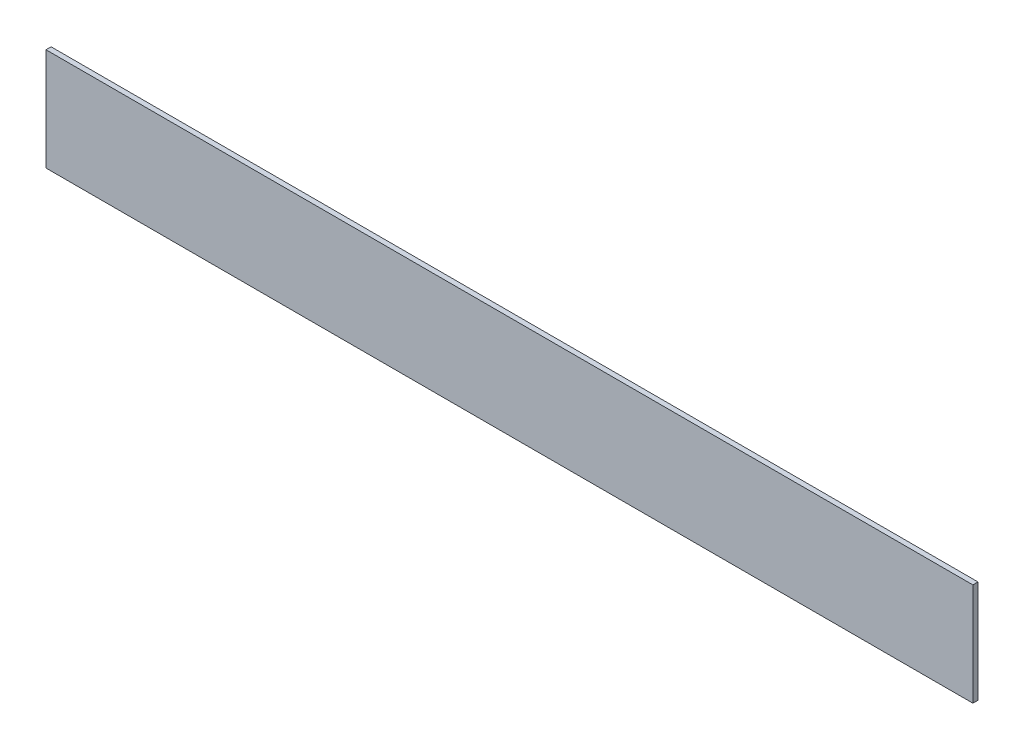
ISO-10303-21;
HEADER;
FILE_DESCRIPTION(('STEP AP214'),'2;1');
FILE_NAME('part.step','',(''),(''),'','','');
FILE_SCHEMA(('AUTOMOTIVE_DESIGN { 1 0 10303 214 1 1 1 1 }'));
ENDSEC;
DATA;
#1=APPLICATION_CONTEXT('core data for automotive mechanical design processes');
#2=APPLICATION_PROTOCOL_DEFINITION('international standard','automotive_design',2000,#1);
#3=PRODUCT_CONTEXT('',#1,'mechanical');
#4=PRODUCT('Part','Part','',(#3));
#5=PRODUCT_RELATED_PRODUCT_CATEGORY('part','',(#4));
#6=PRODUCT_DEFINITION_FORMATION('','',#4);
#7=PRODUCT_DEFINITION_CONTEXT('part definition',#1,'design');
#8=PRODUCT_DEFINITION('design','',#6,#7);
#9=PRODUCT_DEFINITION_SHAPE('','',#8);
#10=(LENGTH_UNIT() NAMED_UNIT(*) SI_UNIT(.MILLI.,.METRE.));
#11=(NAMED_UNIT(*) PLANE_ANGLE_UNIT() SI_UNIT($,.RADIAN.));
#12=(NAMED_UNIT(*) SI_UNIT($,.STERADIAN.) SOLID_ANGLE_UNIT());
#13=UNCERTAINTY_MEASURE_WITH_UNIT(LENGTH_MEASURE(1.E-05),#10,'distance_accuracy_value','');
#14=(GEOMETRIC_REPRESENTATION_CONTEXT(3) GLOBAL_UNCERTAINTY_ASSIGNED_CONTEXT((#13)) GLOBAL_UNIT_ASSIGNED_CONTEXT((#10,
#11,#12)) REPRESENTATION_CONTEXT('',''));
#15=CARTESIAN_POINT('',(0.,0.,0.));
#16=DIRECTION('',(0.,0.,1.));
#17=DIRECTION('',(1.,0.,0.));
#18=AXIS2_PLACEMENT_3D('',#15,#16,#17);
#19=CARTESIAN_POINT('',(-904.5,99.9999999999999,10.));
#20=DIRECTION('',(1.,0.,0.));
#21=DIRECTION('',(0.,0.,-1.));
#22=AXIS2_PLACEMENT_3D('',#19,#20,#21);
#23=PLANE('',#22);
#24=DIRECTION('',(0.,-1.,0.));
#25=VECTOR('',#24,1.);
#26=CARTESIAN_POINT('',(-904.5,99.9999999999999,0.));
#27=LINE('',#26,#25);
#28=CARTESIAN_POINT('',(-904.5,99.9999999999999,0.));
#29=VERTEX_POINT('',#28);
#30=CARTESIAN_POINT('',(-904.5,-100.,0.));
#31=VERTEX_POINT('',#30);
#32=EDGE_CURVE('E95',#29,#31,#27,.T.);
#33=ORIENTED_EDGE('',*,*,#32,.T.);
#34=DIRECTION('',(0.,0.,-1.));
#35=VECTOR('',#34,1.);
#36=CARTESIAN_POINT('',(-904.5,-100.,10.));
#37=LINE('',#36,#35);
#38=CARTESIAN_POINT('',(-904.5,-100.,10.));
#39=VERTEX_POINT('',#38);
#40=EDGE_CURVE('E11',#39,#31,#37,.T.);
#41=ORIENTED_EDGE('',*,*,#40,.F.);
#42=DIRECTION('',(0.,-1.,0.));
#43=VECTOR('',#42,1.);
#44=CARTESIAN_POINT('',(-904.5,99.9999999999999,10.));
#45=LINE('',#44,#43);
#46=CARTESIAN_POINT('',(-904.5,99.9999999999999,10.));
#47=VERTEX_POINT('',#46);
#48=EDGE_CURVE('E83',#47,#39,#45,.T.);
#49=ORIENTED_EDGE('',*,*,#48,.F.);
#50=DIRECTION('',(0.,0.,-1.));
#51=VECTOR('',#50,1.);
#52=CARTESIAN_POINT('',(-904.5,99.9999999999999,10.));
#53=LINE('',#52,#51);
#54=EDGE_CURVE('E91',#47,#29,#53,.T.);
#55=ORIENTED_EDGE('',*,*,#54,.T.);
#56=EDGE_LOOP('',(#33,#41,#49,#55));
#57=FACE_BOUND('',#56,.T.);
#58=ADVANCED_FACE('F32',(#57),#23,.F.);
#59=CARTESIAN_POINT('',(904.5,-99.9999999999999,10.));
#60=DIRECTION('',(0.,1.,0.));
#61=DIRECTION('',(-1.,0.,0.));
#62=AXIS2_PLACEMENT_3D('',#59,#60,#61);
#63=PLANE('',#62);
#64=DIRECTION('',(1.,0.,0.));
#65=VECTOR('',#64,1.);
#66=CARTESIAN_POINT('',(904.5,-99.9999999999999,0.));
#67=LINE('',#66,#65);
#68=CARTESIAN_POINT('',(904.5,-99.9999999999999,0.));
#69=VERTEX_POINT('',#68);
#70=EDGE_CURVE('E87',#31,#69,#67,.T.);
#71=ORIENTED_EDGE('',*,*,#70,.T.);
#72=DIRECTION('',(0.,0.,-1.));
#73=VECTOR('',#72,1.);
#74=CARTESIAN_POINT('',(904.5,-99.9999999999999,10.));
#75=LINE('',#74,#73);
#76=CARTESIAN_POINT('',(904.5,-99.9999999999999,10.));
#77=VERTEX_POINT('',#76);
#78=EDGE_CURVE('E40',#77,#69,#75,.T.);
#79=ORIENTED_EDGE('',*,*,#78,.F.);
#80=DIRECTION('',(1.,0.,0.));
#81=VECTOR('',#80,1.);
#82=CARTESIAN_POINT('',(904.5,-99.9999999999999,10.));
#83=LINE('',#82,#81);
#84=EDGE_CURVE('E78',#39,#77,#83,.T.);
#85=ORIENTED_EDGE('',*,*,#84,.F.);
#86=ORIENTED_EDGE('',*,*,#40,.T.);
#87=EDGE_LOOP('',(#71,#79,#85,#86));
#88=FACE_BOUND('',#87,.T.);
#89=ADVANCED_FACE('F86',(#88),#63,.F.);
#90=CARTESIAN_POINT('',(904.5,100.,10.));
#91=DIRECTION('',(-1.,0.,0.));
#92=DIRECTION('',(0.,0.,1.));
#93=AXIS2_PLACEMENT_3D('',#90,#91,#92);
#94=PLANE('',#93);
#95=DIRECTION('',(0.,1.,0.));
#96=VECTOR('',#95,1.);
#97=CARTESIAN_POINT('',(904.5,100.,0.));
#98=LINE('',#97,#96);
#99=CARTESIAN_POINT('',(904.5,100.,0.));
#100=VERTEX_POINT('',#99);
#101=EDGE_CURVE('E65',#69,#100,#98,.T.);
#102=ORIENTED_EDGE('',*,*,#101,.T.);
#103=DIRECTION('',(0.,0.,-1.));
#104=VECTOR('',#103,1.);
#105=CARTESIAN_POINT('',(904.5,100.,10.));
#106=LINE('',#105,#104);
#107=CARTESIAN_POINT('',(904.5,100.,10.));
#108=VERTEX_POINT('',#107);
#109=EDGE_CURVE('E88',#108,#100,#106,.T.);
#110=ORIENTED_EDGE('',*,*,#109,.F.);
#111=DIRECTION('',(0.,1.,0.));
#112=VECTOR('',#111,1.);
#113=CARTESIAN_POINT('',(904.5,100.,10.));
#114=LINE('',#113,#112);
#115=EDGE_CURVE('E81',#77,#108,#114,.T.);
#116=ORIENTED_EDGE('',*,*,#115,.F.);
#117=ORIENTED_EDGE('',*,*,#78,.T.);
#118=EDGE_LOOP('',(#102,#110,#116,#117));
#119=FACE_BOUND('',#118,.T.);
#120=ADVANCED_FACE('F89',(#119),#94,.F.);
#121=CARTESIAN_POINT('',(904.5,100.,10.));
#122=DIRECTION('',(0.,-1.,0.));
#123=DIRECTION('',(1.,0.,0.));
#124=AXIS2_PLACEMENT_3D('',#121,#122,#123);
#125=PLANE('',#124);
#126=DIRECTION('',(-1.,0.,0.));
#127=VECTOR('',#126,1.);
#128=CARTESIAN_POINT('',(904.5,100.,0.));
#129=LINE('',#128,#127);
#130=EDGE_CURVE('E71',#100,#29,#129,.T.);
#131=ORIENTED_EDGE('',*,*,#130,.T.);
#132=ORIENTED_EDGE('',*,*,#54,.F.);
#133=DIRECTION('',(-1.,0.,0.));
#134=VECTOR('',#133,1.);
#135=CARTESIAN_POINT('',(904.5,100.,10.));
#136=LINE('',#135,#134);
#137=EDGE_CURVE('E48',#108,#47,#136,.T.);
#138=ORIENTED_EDGE('',*,*,#137,.F.);
#139=ORIENTED_EDGE('',*,*,#109,.T.);
#140=EDGE_LOOP('',(#131,#132,#138,#139));
#141=FACE_BOUND('',#140,.T.);
#142=ADVANCED_FACE('F102',(#141),#125,.F.);
#143=CARTESIAN_POINT('',(0.,0.,10.));
#144=DIRECTION('',(0.,0.,-1.));
#145=DIRECTION('',(-1.,0.,0.));
#146=AXIS2_PLACEMENT_3D('',#143,#144,#145);
#147=PLANE('',#146);
#148=ORIENTED_EDGE('',*,*,#48,.T.);
#149=ORIENTED_EDGE('',*,*,#84,.T.);
#150=ORIENTED_EDGE('',*,*,#115,.T.);
#151=ORIENTED_EDGE('',*,*,#137,.T.);
#152=EDGE_LOOP('',(#148,#149,#150,#151));
#153=FACE_BOUND('',#152,.T.);
#154=ADVANCED_FACE('F79',(#153),#147,.F.);
#155=CARTESIAN_POINT('',(0.,0.,0.));
#156=DIRECTION('',(0.,0.,-1.));
#157=DIRECTION('',(-1.,0.,0.));
#158=AXIS2_PLACEMENT_3D('',#155,#156,#157);
#159=PLANE('',#158);
#160=ORIENTED_EDGE('',*,*,#32,.F.);
#161=ORIENTED_EDGE('',*,*,#130,.F.);
#162=ORIENTED_EDGE('',*,*,#101,.F.);
#163=ORIENTED_EDGE('',*,*,#70,.F.);
#164=EDGE_LOOP('',(#160,#161,#162,#163));
#165=FACE_BOUND('',#164,.T.);
#166=ADVANCED_FACE('F105',(#165),#159,.T.);
#167=CLOSED_SHELL('',(#58,#89,#120,#142,#154,#166));
#168=MANIFOLD_SOLID_BREP('B2',#167);
#169=ADVANCED_BREP_SHAPE_REPRESENTATION('',(#18,#168),#14);
#170=SHAPE_DEFINITION_REPRESENTATION(#9,#169);
ENDSEC;
END-ISO-10303-21;
